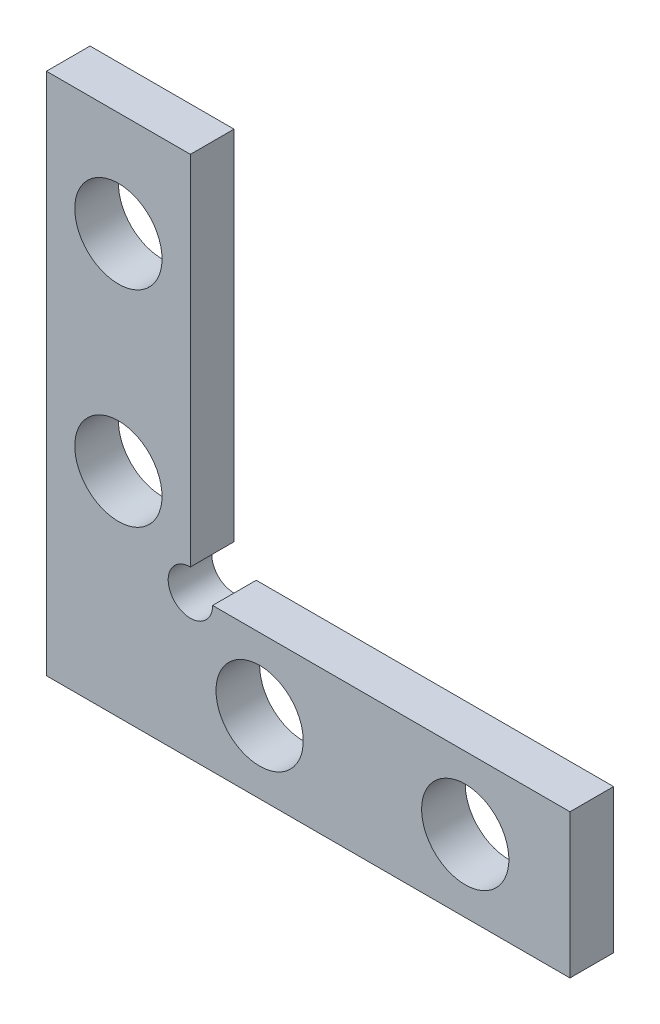
ISO-10303-21;
HEADER;
FILE_DESCRIPTION(('STEP AP214'),'2;1');
FILE_NAME('part.step','',(''),(''),'','','');
FILE_SCHEMA(('AUTOMOTIVE_DESIGN { 1 0 10303 214 1 1 1 1 }'));
ENDSEC;
DATA;
#1=APPLICATION_CONTEXT('core data for automotive mechanical design processes');
#2=APPLICATION_PROTOCOL_DEFINITION('international standard','automotive_design',2000,#1);
#3=PRODUCT_CONTEXT('',#1,'mechanical');
#4=PRODUCT('Part','Part','',(#3));
#5=PRODUCT_RELATED_PRODUCT_CATEGORY('part','',(#4));
#6=PRODUCT_DEFINITION_FORMATION('','',#4);
#7=PRODUCT_DEFINITION_CONTEXT('part definition',#1,'design');
#8=PRODUCT_DEFINITION('design','',#6,#7);
#9=PRODUCT_DEFINITION_SHAPE('','',#8);
#10=(LENGTH_UNIT() NAMED_UNIT(*) SI_UNIT(.MILLI.,.METRE.));
#11=(NAMED_UNIT(*) PLANE_ANGLE_UNIT() SI_UNIT($,.RADIAN.));
#12=(NAMED_UNIT(*) SI_UNIT($,.STERADIAN.) SOLID_ANGLE_UNIT());
#13=UNCERTAINTY_MEASURE_WITH_UNIT(LENGTH_MEASURE(1.E-05),#10,'distance_accuracy_value','');
#14=(GEOMETRIC_REPRESENTATION_CONTEXT(3) GLOBAL_UNCERTAINTY_ASSIGNED_CONTEXT((#13)) GLOBAL_UNIT_ASSIGNED_CONTEXT((#10,
#11,#12)) REPRESENTATION_CONTEXT('',''));
#15=CARTESIAN_POINT('',(0.,0.,0.));
#16=DIRECTION('',(0.,0.,1.));
#17=DIRECTION('',(1.,0.,0.));
#18=AXIS2_PLACEMENT_3D('',#15,#16,#17);
#19=CARTESIAN_POINT('',(0.,0.,3.));
#20=DIRECTION('',(1.,0.,0.));
#21=DIRECTION('',(0.,1.,0.));
#22=AXIS2_PLACEMENT_3D('',#19,#20,#21);
#23=PLANE('',#22);
#24=DIRECTION('',(0.,-1.,0.));
#25=VECTOR('',#24,1.);
#26=CARTESIAN_POINT('',(0.,0.,0.));
#27=LINE('',#26,#25);
#28=CARTESIAN_POINT('',(0.,36.,0.));
#29=VERTEX_POINT('',#28);
#30=CARTESIAN_POINT('',(0.,0.,0.));
#31=VERTEX_POINT('',#30);
#32=EDGE_CURVE('E120',#29,#31,#27,.T.);
#33=ORIENTED_EDGE('',*,*,#32,.T.);
#34=DIRECTION('',(0.,0.,-1.));
#35=VECTOR('',#34,1.);
#36=CARTESIAN_POINT('',(0.,0.,3.));
#37=LINE('',#36,#35);
#38=CARTESIAN_POINT('',(0.,0.,3.));
#39=VERTEX_POINT('',#38);
#40=EDGE_CURVE('E38',#39,#31,#37,.T.);
#41=ORIENTED_EDGE('',*,*,#40,.F.);
#42=DIRECTION('',(0.,-1.,0.));
#43=VECTOR('',#42,1.);
#44=CARTESIAN_POINT('',(0.,0.,3.));
#45=LINE('',#44,#43);
#46=CARTESIAN_POINT('',(0.,36.,3.));
#47=VERTEX_POINT('',#46);
#48=EDGE_CURVE('E74',#47,#39,#45,.T.);
#49=ORIENTED_EDGE('',*,*,#48,.F.);
#50=DIRECTION('',(0.,0.,-1.));
#51=VECTOR('',#50,1.);
#52=CARTESIAN_POINT('',(0.,36.,3.));
#53=LINE('',#52,#51);
#54=EDGE_CURVE('E115',#47,#29,#53,.T.);
#55=ORIENTED_EDGE('',*,*,#54,.T.);
#56=EDGE_LOOP('',(#33,#41,#49,#55));
#57=FACE_BOUND('',#56,.T.);
#58=ADVANCED_FACE('F31',(#57),#23,.F.);
#59=CARTESIAN_POINT('',(0.,0.,3.));
#60=DIRECTION('',(0.,1.,0.));
#61=DIRECTION('',(0.,0.,1.));
#62=AXIS2_PLACEMENT_3D('',#59,#60,#61);
#63=PLANE('',#62);
#64=DIRECTION('',(1.,0.,0.));
#65=VECTOR('',#64,1.);
#66=CARTESIAN_POINT('',(0.,0.,0.));
#67=LINE('',#66,#65);
#68=CARTESIAN_POINT('',(36.,0.,0.));
#69=VERTEX_POINT('',#68);
#70=EDGE_CURVE('E122',#31,#69,#67,.T.);
#71=ORIENTED_EDGE('',*,*,#70,.T.);
#72=DIRECTION('',(0.,0.,1.));
#73=VECTOR('',#72,1.);
#74=CARTESIAN_POINT('',(36.,0.,0.));
#75=LINE('',#74,#73);
#76=CARTESIAN_POINT('',(36.,0.,3.));
#77=VERTEX_POINT('',#76);
#78=EDGE_CURVE('E149',#69,#77,#75,.T.);
#79=ORIENTED_EDGE('',*,*,#78,.T.);
#80=DIRECTION('',(1.,0.,0.));
#81=VECTOR('',#80,1.);
#82=CARTESIAN_POINT('',(0.,0.,3.));
#83=LINE('',#82,#81);
#84=EDGE_CURVE('E113',#39,#77,#83,.T.);
#85=ORIENTED_EDGE('',*,*,#84,.F.);
#86=ORIENTED_EDGE('',*,*,#40,.T.);
#87=EDGE_LOOP('',(#71,#79,#85,#86));
#88=FACE_BOUND('',#87,.T.);
#89=ADVANCED_FACE('F132',(#88),#63,.F.);
#90=CARTESIAN_POINT('',(9.9,0.,3.));
#91=DIRECTION('',(-1.,0.,0.));
#92=DIRECTION('',(0.,-1.,0.));
#93=AXIS2_PLACEMENT_3D('',#90,#91,#92);
#94=PLANE('',#93);
#95=DIRECTION('',(0.,1.,0.));
#96=VECTOR('',#95,1.);
#97=CARTESIAN_POINT('',(9.9,0.,3.));
#98=LINE('',#97,#96);
#99=CARTESIAN_POINT('',(9.9,11.4270944416175,3.));
#100=VERTEX_POINT('',#99);
#101=CARTESIAN_POINT('',(9.89999999999999,36.,3.));
#102=VERTEX_POINT('',#101);
#103=EDGE_CURVE('E105',#100,#102,#98,.T.);
#104=ORIENTED_EDGE('',*,*,#103,.F.);
#105=DIRECTION('',(0.,0.,1.));
#106=VECTOR('',#105,1.);
#107=CARTESIAN_POINT('',(9.9,11.4270944416175,0.));
#108=LINE('',#107,#106);
#109=CARTESIAN_POINT('',(9.9,11.4270944416175,0.));
#110=VERTEX_POINT('',#109);
#111=EDGE_CURVE('E94',#100,#110,#108,.F.);
#112=ORIENTED_EDGE('',*,*,#111,.T.);
#113=DIRECTION('',(0.,1.,0.));
#114=VECTOR('',#113,1.);
#115=CARTESIAN_POINT('',(9.9,0.,0.));
#116=LINE('',#115,#114);
#117=CARTESIAN_POINT('',(9.89999999999999,36.,0.));
#118=VERTEX_POINT('',#117);
#119=EDGE_CURVE('E125',#110,#118,#116,.T.);
#120=ORIENTED_EDGE('',*,*,#119,.T.);
#121=DIRECTION('',(0.,0.,-1.));
#122=VECTOR('',#121,1.);
#123=CARTESIAN_POINT('',(9.89999999999999,36.,3.));
#124=LINE('',#123,#122);
#125=EDGE_CURVE('E112',#102,#118,#124,.T.);
#126=ORIENTED_EDGE('',*,*,#125,.F.);
#127=EDGE_LOOP('',(#104,#112,#120,#126));
#128=FACE_BOUND('',#127,.T.);
#129=ADVANCED_FACE('F111',(#128),#94,.F.);
#130=CARTESIAN_POINT('',(0.,36.,3.));
#131=DIRECTION('',(0.,-1.,0.));
#132=DIRECTION('',(0.,0.,-1.));
#133=AXIS2_PLACEMENT_3D('',#130,#131,#132);
#134=PLANE('',#133);
#135=DIRECTION('',(-1.,0.,0.));
#136=VECTOR('',#135,1.);
#137=CARTESIAN_POINT('',(0.,36.,0.));
#138=LINE('',#137,#136);
#139=EDGE_CURVE('E70',#118,#29,#138,.T.);
#140=ORIENTED_EDGE('',*,*,#139,.T.);
#141=ORIENTED_EDGE('',*,*,#54,.F.);
#142=DIRECTION('',(-1.,0.,0.));
#143=VECTOR('',#142,1.);
#144=CARTESIAN_POINT('',(0.,36.,3.));
#145=LINE('',#144,#143);
#146=EDGE_CURVE('E53',#102,#47,#145,.T.);
#147=ORIENTED_EDGE('',*,*,#146,.F.);
#148=ORIENTED_EDGE('',*,*,#125,.T.);
#149=EDGE_LOOP('',(#140,#141,#147,#148));
#150=FACE_BOUND('',#149,.T.);
#151=ADVANCED_FACE('F191',(#150),#134,.F.);
#152=CARTESIAN_POINT('',(0.,36.,3.));
#153=DIRECTION('',(0.,0.,-1.));
#154=DIRECTION('',(-1.,0.,0.));
#155=AXIS2_PLACEMENT_3D('',#152,#153,#154);
#156=PLANE('',#155);
#157=CARTESIAN_POINT('',(28.7978043461915,4.95,3.));
#158=DIRECTION('',(0.,0.,1.));
#159=DIRECTION('',(-1.,0.,0.));
#160=AXIS2_PLACEMENT_3D('',#157,#158,#159);
#161=CIRCLE('',#160,3.);
#162=CARTESIAN_POINT('',(25.7978043461915,4.95,3.));
#163=VERTEX_POINT('',#162);
#164=EDGE_CURVE('E101',#163,#163,#161,.T.);
#165=ORIENTED_EDGE('',*,*,#164,.F.);
#166=EDGE_LOOP('',(#165));
#167=FACE_BOUND('',#166,.T.);
#168=CARTESIAN_POINT('',(14.661403113016,4.95,3.));
#169=DIRECTION('',(0.,0.,1.));
#170=DIRECTION('',(-1.,0.,0.));
#171=AXIS2_PLACEMENT_3D('',#168,#169,#170);
#172=CIRCLE('',#171,3.);
#173=CARTESIAN_POINT('',(11.661403113016,4.95,3.));
#174=VERTEX_POINT('',#173);
#175=EDGE_CURVE('E169',#174,#174,#172,.T.);
#176=ORIENTED_EDGE('',*,*,#175,.F.);
#177=EDGE_LOOP('',(#176));
#178=FACE_BOUND('',#177,.T.);
#179=CARTESIAN_POINT('',(4.94999999999999,14.661403113016,3.));
#180=DIRECTION('',(0.,0.,1.));
#181=DIRECTION('',(1.,0.,0.));
#182=AXIS2_PLACEMENT_3D('',#179,#180,#181);
#183=CIRCLE('',#182,3.);
#184=CARTESIAN_POINT('',(7.94999999999999,14.661403113016,3.));
#185=VERTEX_POINT('',#184);
#186=EDGE_CURVE('E175',#185,#185,#183,.T.);
#187=ORIENTED_EDGE('',*,*,#186,.F.);
#188=EDGE_LOOP('',(#187));
#189=FACE_BOUND('',#188,.T.);
#190=CARTESIAN_POINT('',(4.94999999999999,28.7978043461915,3.));
#191=DIRECTION('',(0.,0.,1.));
#192=DIRECTION('',(1.,0.,0.));
#193=AXIS2_PLACEMENT_3D('',#190,#191,#192);
#194=CIRCLE('',#193,3.);
#195=CARTESIAN_POINT('',(7.94999999999999,28.7978043461915,3.));
#196=VERTEX_POINT('',#195);
#197=EDGE_CURVE('E154',#196,#196,#194,.T.);
#198=ORIENTED_EDGE('',*,*,#197,.F.);
#199=EDGE_LOOP('',(#198));
#200=FACE_BOUND('',#199,.T.);
#201=DIRECTION('',(-1.,0.,0.));
#202=VECTOR('',#201,1.);
#203=CARTESIAN_POINT('',(0.,9.9,3.));
#204=LINE('',#203,#202);
#205=CARTESIAN_POINT('',(36.,9.9,3.));
#206=VERTEX_POINT('',#205);
#207=CARTESIAN_POINT('',(11.4270944416175,9.9,3.));
#208=VERTEX_POINT('',#207);
#209=EDGE_CURVE('E109',#206,#208,#204,.T.);
#210=ORIENTED_EDGE('',*,*,#209,.T.);
#211=CARTESIAN_POINT('',(9.9,9.9,3.));
#212=DIRECTION('',(0.,0.,1.));
#213=DIRECTION('',(1.,0.,0.));
#214=AXIS2_PLACEMENT_3D('',#211,#212,#213);
#215=CIRCLE('',#214,1.52709444161755);
#216=EDGE_CURVE('E44',#100,#208,#215,.T.);
#217=ORIENTED_EDGE('',*,*,#216,.F.);
#218=ORIENTED_EDGE('',*,*,#103,.T.);
#219=ORIENTED_EDGE('',*,*,#146,.T.);
#220=ORIENTED_EDGE('',*,*,#48,.T.);
#221=ORIENTED_EDGE('',*,*,#84,.T.);
#222=DIRECTION('',(0.,1.,0.));
#223=VECTOR('',#222,1.);
#224=CARTESIAN_POINT('',(36.,0.,3.));
#225=LINE('',#224,#223);
#226=EDGE_CURVE('E151',#77,#206,#225,.T.);
#227=ORIENTED_EDGE('',*,*,#226,.T.);
#228=EDGE_LOOP('',(#210,#217,#218,#219,#220,#221,#227));
#229=FACE_BOUND('',#228,.T.);
#230=ADVANCED_FACE('F104',(#167,#178,#189,#200,#229),#156,.F.);
#231=CARTESIAN_POINT('',(0.,36.,0.));
#232=DIRECTION('',(0.,0.,-1.));
#233=DIRECTION('',(-1.,0.,0.));
#234=AXIS2_PLACEMENT_3D('',#231,#232,#233);
#235=PLANE('',#234);
#236=CARTESIAN_POINT('',(9.9,9.9,0.));
#237=DIRECTION('',(0.,0.,1.));
#238=DIRECTION('',(1.,0.,0.));
#239=AXIS2_PLACEMENT_3D('',#236,#237,#238);
#240=CIRCLE('',#239,1.52709444161755);
#241=CARTESIAN_POINT('',(11.4270944416175,9.9,0.));
#242=VERTEX_POINT('',#241);
#243=EDGE_CURVE('E97',#110,#242,#240,.T.);
#244=ORIENTED_EDGE('',*,*,#243,.T.);
#245=DIRECTION('',(-1.,0.,0.));
#246=VECTOR('',#245,1.);
#247=CARTESIAN_POINT('',(0.,9.9,0.));
#248=LINE('',#247,#246);
#249=CARTESIAN_POINT('',(36.,9.9,0.));
#250=VERTEX_POINT('',#249);
#251=EDGE_CURVE('E146',#250,#242,#248,.T.);
#252=ORIENTED_EDGE('',*,*,#251,.F.);
#253=DIRECTION('',(0.,1.,0.));
#254=VECTOR('',#253,1.);
#255=CARTESIAN_POINT('',(36.,0.,0.));
#256=LINE('',#255,#254);
#257=EDGE_CURVE('E144',#69,#250,#256,.T.);
#258=ORIENTED_EDGE('',*,*,#257,.F.);
#259=ORIENTED_EDGE('',*,*,#70,.F.);
#260=ORIENTED_EDGE('',*,*,#32,.F.);
#261=ORIENTED_EDGE('',*,*,#139,.F.);
#262=ORIENTED_EDGE('',*,*,#119,.F.);
#263=EDGE_LOOP('',(#244,#252,#258,#259,#260,#261,#262));
#264=FACE_BOUND('',#263,.T.);
#265=CARTESIAN_POINT('',(28.7978043461915,4.95,0.));
#266=DIRECTION('',(0.,0.,1.));
#267=DIRECTION('',(-1.,0.,0.));
#268=AXIS2_PLACEMENT_3D('',#265,#266,#267);
#269=CIRCLE('',#268,3.);
#270=CARTESIAN_POINT('',(25.7978043461915,4.95,0.));
#271=VERTEX_POINT('',#270);
#272=EDGE_CURVE('E166',#271,#271,#269,.T.);
#273=ORIENTED_EDGE('',*,*,#272,.T.);
#274=EDGE_LOOP('',(#273));
#275=FACE_BOUND('',#274,.T.);
#276=CARTESIAN_POINT('',(14.661403113016,4.95,0.));
#277=DIRECTION('',(0.,0.,1.));
#278=DIRECTION('',(-1.,0.,0.));
#279=AXIS2_PLACEMENT_3D('',#276,#277,#278);
#280=CIRCLE('',#279,3.);
#281=CARTESIAN_POINT('',(11.661403113016,4.95,0.));
#282=VERTEX_POINT('',#281);
#283=EDGE_CURVE('E172',#282,#282,#280,.T.);
#284=ORIENTED_EDGE('',*,*,#283,.T.);
#285=EDGE_LOOP('',(#284));
#286=FACE_BOUND('',#285,.T.);
#287=CARTESIAN_POINT('',(4.94999999999999,14.661403113016,0.));
#288=DIRECTION('',(0.,0.,1.));
#289=DIRECTION('',(1.,0.,0.));
#290=AXIS2_PLACEMENT_3D('',#287,#288,#289);
#291=CIRCLE('',#290,3.);
#292=CARTESIAN_POINT('',(7.94999999999999,14.661403113016,0.));
#293=VERTEX_POINT('',#292);
#294=EDGE_CURVE('E178',#293,#293,#291,.T.);
#295=ORIENTED_EDGE('',*,*,#294,.T.);
#296=EDGE_LOOP('',(#295));
#297=FACE_BOUND('',#296,.T.);
#298=CARTESIAN_POINT('',(4.94999999999999,28.7978043461915,0.));
#299=DIRECTION('',(0.,0.,1.));
#300=DIRECTION('',(1.,0.,0.));
#301=AXIS2_PLACEMENT_3D('',#298,#299,#300);
#302=CIRCLE('',#301,3.);
#303=CARTESIAN_POINT('',(7.94999999999999,28.7978043461915,0.));
#304=VERTEX_POINT('',#303);
#305=EDGE_CURVE('E157',#304,#304,#302,.T.);
#306=ORIENTED_EDGE('',*,*,#305,.T.);
#307=EDGE_LOOP('',(#306));
#308=FACE_BOUND('',#307,.T.);
#309=ADVANCED_FACE('F140',(#264,#275,#286,#297,#308),#235,.T.);
#310=CARTESIAN_POINT('',(0.,9.9,0.));
#311=DIRECTION('',(0.,1.,0.));
#312=DIRECTION('',(0.,0.,1.));
#313=AXIS2_PLACEMENT_3D('',#310,#311,#312);
#314=PLANE('',#313);
#315=DIRECTION('',(0.,0.,1.));
#316=VECTOR('',#315,1.);
#317=CARTESIAN_POINT('',(11.4270944416175,9.9,0.));
#318=LINE('',#317,#316);
#319=EDGE_CURVE('E11',#208,#242,#318,.F.);
#320=ORIENTED_EDGE('',*,*,#319,.F.);
#321=ORIENTED_EDGE('',*,*,#209,.F.);
#322=DIRECTION('',(0.,0.,1.));
#323=VECTOR('',#322,1.);
#324=CARTESIAN_POINT('',(36.,9.9,0.));
#325=LINE('',#324,#323);
#326=EDGE_CURVE('E123',#250,#206,#325,.T.);
#327=ORIENTED_EDGE('',*,*,#326,.F.);
#328=ORIENTED_EDGE('',*,*,#251,.T.);
#329=EDGE_LOOP('',(#320,#321,#327,#328));
#330=FACE_BOUND('',#329,.T.);
#331=ADVANCED_FACE('F163',(#330),#314,.T.);
#332=CARTESIAN_POINT('',(36.,0.,0.));
#333=DIRECTION('',(1.,0.,0.));
#334=DIRECTION('',(0.,0.,-1.));
#335=AXIS2_PLACEMENT_3D('',#332,#333,#334);
#336=PLANE('',#335);
#337=ORIENTED_EDGE('',*,*,#226,.F.);
#338=ORIENTED_EDGE('',*,*,#78,.F.);
#339=ORIENTED_EDGE('',*,*,#257,.T.);
#340=ORIENTED_EDGE('',*,*,#326,.T.);
#341=EDGE_LOOP('',(#337,#338,#339,#340));
#342=FACE_BOUND('',#341,.T.);
#343=ADVANCED_FACE('F161',(#342),#336,.T.);
#344=CARTESIAN_POINT('',(4.94999999999999,28.7978043461915,0.));
#345=DIRECTION('',(0.,0.,1.));
#346=DIRECTION('',(1.,0.,0.));
#347=AXIS2_PLACEMENT_3D('',#344,#345,#346);
#348=CYLINDRICAL_SURFACE('',#347,3.);
#349=ORIENTED_EDGE('',*,*,#305,.F.);
#350=EDGE_LOOP('',(#349));
#351=FACE_BOUND('',#350,.T.);
#352=ORIENTED_EDGE('',*,*,#197,.T.);
#353=EDGE_LOOP('',(#352));
#354=FACE_BOUND('',#353,.T.);
#355=ADVANCED_FACE('F188',(#351,#354),#348,.F.);
#356=CARTESIAN_POINT('',(4.94999999999999,14.661403113016,0.));
#357=DIRECTION('',(0.,0.,1.));
#358=DIRECTION('',(1.,0.,0.));
#359=AXIS2_PLACEMENT_3D('',#356,#357,#358);
#360=CYLINDRICAL_SURFACE('',#359,3.);
#361=ORIENTED_EDGE('',*,*,#294,.F.);
#362=EDGE_LOOP('',(#361));
#363=FACE_BOUND('',#362,.T.);
#364=ORIENTED_EDGE('',*,*,#186,.T.);
#365=EDGE_LOOP('',(#364));
#366=FACE_BOUND('',#365,.T.);
#367=ADVANCED_FACE('F248',(#363,#366),#360,.F.);
#368=CARTESIAN_POINT('',(14.661403113016,4.95,0.));
#369=DIRECTION('',(0.,0.,1.));
#370=DIRECTION('',(1.,0.,0.));
#371=AXIS2_PLACEMENT_3D('',#368,#369,#370);
#372=CYLINDRICAL_SURFACE('',#371,3.);
#373=ORIENTED_EDGE('',*,*,#283,.F.);
#374=EDGE_LOOP('',(#373));
#375=FACE_BOUND('',#374,.T.);
#376=ORIENTED_EDGE('',*,*,#175,.T.);
#377=EDGE_LOOP('',(#376));
#378=FACE_BOUND('',#377,.T.);
#379=ADVANCED_FACE('F258',(#375,#378),#372,.F.);
#380=CARTESIAN_POINT('',(28.7978043461915,4.95,0.));
#381=DIRECTION('',(0.,0.,1.));
#382=DIRECTION('',(1.,0.,0.));
#383=AXIS2_PLACEMENT_3D('',#380,#381,#382);
#384=CYLINDRICAL_SURFACE('',#383,3.);
#385=ORIENTED_EDGE('',*,*,#272,.F.);
#386=EDGE_LOOP('',(#385));
#387=FACE_BOUND('',#386,.T.);
#388=ORIENTED_EDGE('',*,*,#164,.T.);
#389=EDGE_LOOP('',(#388));
#390=FACE_BOUND('',#389,.T.);
#391=ADVANCED_FACE('F267',(#387,#390),#384,.F.);
#392=CARTESIAN_POINT('',(9.9,9.9,0.));
#393=DIRECTION('',(0.,0.,1.));
#394=DIRECTION('',(1.,0.,0.));
#395=AXIS2_PLACEMENT_3D('',#392,#393,#394);
#396=CYLINDRICAL_SURFACE('',#395,1.52709444161755);
#397=ORIENTED_EDGE('',*,*,#216,.T.);
#398=ORIENTED_EDGE('',*,*,#319,.T.);
#399=ORIENTED_EDGE('',*,*,#243,.F.);
#400=ORIENTED_EDGE('',*,*,#111,.F.);
#401=EDGE_LOOP('',(#397,#398,#399,#400));
#402=FACE_BOUND('',#401,.T.);
#403=ADVANCED_FACE('F95',(#402),#396,.F.);
#404=CLOSED_SHELL('',(#58,#89,#129,#151,#230,#309,#331,#343,#355,#367,#379,#391,#403));
#405=MANIFOLD_SOLID_BREP('B2',#404);
#406=ADVANCED_BREP_SHAPE_REPRESENTATION('',(#18,#405),#14);
#407=SHAPE_DEFINITION_REPRESENTATION(#9,#406);
ENDSEC;
END-ISO-10303-21;
